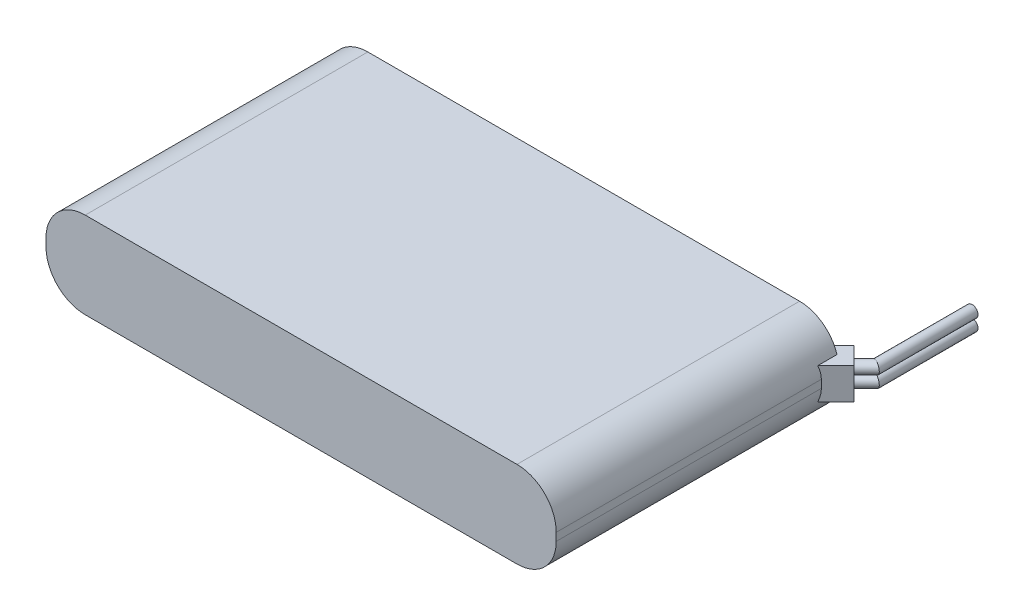
ISO-10303-21;
HEADER;
FILE_DESCRIPTION(('STEP AP214'),'2;1');
FILE_NAME('part.step','',(''),(''),'','','');
FILE_SCHEMA(('AUTOMOTIVE_DESIGN { 1 0 10303 214 1 1 1 1 }'));
ENDSEC;
DATA;
#1=APPLICATION_CONTEXT('core data for automotive mechanical design processes');
#2=APPLICATION_PROTOCOL_DEFINITION('international standard','automotive_design',2000,#1);
#3=PRODUCT_CONTEXT('',#1,'mechanical');
#4=PRODUCT('Part','Part','',(#3));
#5=PRODUCT_RELATED_PRODUCT_CATEGORY('part','',(#4));
#6=PRODUCT_DEFINITION_FORMATION('','',#4);
#7=PRODUCT_DEFINITION_CONTEXT('part definition',#1,'design');
#8=PRODUCT_DEFINITION('design','',#6,#7);
#9=PRODUCT_DEFINITION_SHAPE('','',#8);
#10=(LENGTH_UNIT() NAMED_UNIT(*) SI_UNIT(.MILLI.,.METRE.));
#11=(NAMED_UNIT(*) PLANE_ANGLE_UNIT() SI_UNIT($,.RADIAN.));
#12=(NAMED_UNIT(*) SI_UNIT($,.STERADIAN.) SOLID_ANGLE_UNIT());
#13=UNCERTAINTY_MEASURE_WITH_UNIT(LENGTH_MEASURE(1.E-05),#10,'distance_accuracy_value','');
#14=(GEOMETRIC_REPRESENTATION_CONTEXT(3) GLOBAL_UNCERTAINTY_ASSIGNED_CONTEXT((#13)) GLOBAL_UNIT_ASSIGNED_CONTEXT((#10,
#11,#12)) REPRESENTATION_CONTEXT('',''));
#15=CARTESIAN_POINT('',(0.,0.,0.));
#16=DIRECTION('',(0.,0.,1.));
#17=DIRECTION('',(1.,0.,0.));
#18=AXIS2_PLACEMENT_3D('',#15,#16,#17);
#19=CARTESIAN_POINT('',(-62.2295081967213,22.,-41.1311475409835));
#20=DIRECTION('',(0.,0.,1.));
#21=DIRECTION('',(1.,0.,0.));
#22=AXIS2_PLACEMENT_3D('',#19,#20,#21);
#23=PLANE('',#22);
#24=DIRECTION('',(-1.,0.,0.));
#25=VECTOR('',#24,1.);
#26=CARTESIAN_POINT('',(-62.2295081967213,7.,-41.1311475409835));
#27=LINE('',#26,#25);
#28=CARTESIAN_POINT('',(67.3098838174481,7.,-41.1311475409835));
#29=VERTEX_POINT('',#28);
#30=CARTESIAN_POINT('',(63.3157190818035,7.,-41.1311475409835));
#31=VERTEX_POINT('',#30);
#32=EDGE_CURVE('E207',#29,#31,#27,.T.);
#33=ORIENTED_EDGE('',*,*,#32,.F.);
#34=CARTESIAN_POINT('',(57.7704918032787,10.,-41.1311475409835));
#35=DIRECTION('',(0.,0.,1.));
#36=DIRECTION('',(1.,0.,0.));
#37=AXIS2_PLACEMENT_3D('',#34,#35,#36);
#38=CIRCLE('',#37,10.);
#39=CARTESIAN_POINT('',(57.7704918032787,0.,-41.1311475409835));
#40=VERTEX_POINT('',#39);
#41=EDGE_CURVE('E254',#29,#40,#38,.F.);
#42=ORIENTED_EDGE('',*,*,#41,.T.);
#43=DIRECTION('',(-1.,0.,0.));
#44=VECTOR('',#43,1.);
#45=CARTESIAN_POINT('',(-62.2295081967213,0.,-41.1311475409835));
#46=LINE('',#45,#44);
#47=CARTESIAN_POINT('',(-52.2295081967213,0.,-41.1311475409835));
#48=VERTEX_POINT('',#47);
#49=EDGE_CURVE('E216',#40,#48,#46,.T.);
#50=ORIENTED_EDGE('',*,*,#49,.T.);
#51=CARTESIAN_POINT('',(-52.2295081967213,10.,-41.1311475409835));
#52=DIRECTION('',(0.,0.,1.));
#53=DIRECTION('',(1.,0.,0.));
#54=AXIS2_PLACEMENT_3D('',#51,#52,#53);
#55=CIRCLE('',#54,10.);
#56=CARTESIAN_POINT('',(-62.2295081967213,10.,-41.1311475409835));
#57=VERTEX_POINT('',#56);
#58=EDGE_CURVE('E248',#48,#57,#55,.F.);
#59=ORIENTED_EDGE('',*,*,#58,.T.);
#60=DIRECTION('',(0.,-1.,0.));
#61=VECTOR('',#60,1.);
#62=CARTESIAN_POINT('',(-62.2295081967213,22.,-41.1311475409835));
#63=LINE('',#62,#61);
#64=CARTESIAN_POINT('',(-62.2295081967213,12.,-41.1311475409835));
#65=VERTEX_POINT('',#64);
#66=EDGE_CURVE('E220',#65,#57,#63,.T.);
#67=ORIENTED_EDGE('',*,*,#66,.F.);
#68=CARTESIAN_POINT('',(-52.2295081967213,12.,-41.1311475409835));
#69=DIRECTION('',(0.,0.,1.));
#70=DIRECTION('',(1.,0.,0.));
#71=AXIS2_PLACEMENT_3D('',#68,#69,#70);
#72=CIRCLE('',#71,10.);
#73=CARTESIAN_POINT('',(-52.2295081967213,22.,-41.1311475409835));
#74=VERTEX_POINT('',#73);
#75=EDGE_CURVE('E245',#65,#74,#72,.F.);
#76=ORIENTED_EDGE('',*,*,#75,.T.);
#77=DIRECTION('',(-1.,0.,0.));
#78=VECTOR('',#77,1.);
#79=CARTESIAN_POINT('',(-62.2295081967213,22.,-41.1311475409835));
#80=LINE('',#79,#78);
#81=CARTESIAN_POINT('',(57.7704918032787,22.,-41.1311475409835));
#82=VERTEX_POINT('',#81);
#83=EDGE_CURVE('E215',#82,#74,#80,.T.);
#84=ORIENTED_EDGE('',*,*,#83,.F.);
#85=CARTESIAN_POINT('',(57.7704918032787,12.,-41.1311475409835));
#86=DIRECTION('',(0.,0.,1.));
#87=DIRECTION('',(1.,0.,0.));
#88=AXIS2_PLACEMENT_3D('',#85,#86,#87);
#89=CIRCLE('',#88,10.);
#90=CARTESIAN_POINT('',(67.3098838174481,15.,-41.1311475409835));
#91=VERTEX_POINT('',#90);
#92=EDGE_CURVE('E251',#82,#91,#89,.F.);
#93=ORIENTED_EDGE('',*,*,#92,.T.);
#94=DIRECTION('',(-1.,0.,0.));
#95=VECTOR('',#94,1.);
#96=CARTESIAN_POINT('',(-62.2295081967213,15.,-41.1311475409835));
#97=LINE('',#96,#95);
#98=CARTESIAN_POINT('',(63.3157190818035,15.,-41.1311475409835));
#99=VERTEX_POINT('',#98);
#100=EDGE_CURVE('E89',#91,#99,#97,.T.);
#101=ORIENTED_EDGE('',*,*,#100,.T.);
#102=DIRECTION('',(0.,1.,0.));
#103=VECTOR('',#102,1.);
#104=CARTESIAN_POINT('',(63.3157190818035,22.,-41.1311475409835));
#105=LINE('',#104,#103);
#106=EDGE_CURVE('E78',#31,#99,#105,.T.);
#107=ORIENTED_EDGE('',*,*,#106,.F.);
#108=EDGE_LOOP('',(#33,#42,#50,#59,#67,#76,#84,#93,#101,#107));
#109=FACE_BOUND('',#108,.T.);
#110=ADVANCED_FACE('F69',(#109),#23,.F.);
#111=CARTESIAN_POINT('',(-62.2295081967213,22.,-41.1311475409835));
#112=DIRECTION('',(1.,0.,0.));
#113=DIRECTION('',(0.,0.,-1.));
#114=AXIS2_PLACEMENT_3D('',#111,#112,#113);
#115=PLANE('',#114);
#116=ORIENTED_EDGE('',*,*,#66,.T.);
#117=DIRECTION('',(0.,0.,1.));
#118=VECTOR('',#117,1.);
#119=CARTESIAN_POINT('',(-62.2295081967213,10.,-41.1311475409835));
#120=LINE('',#119,#118);
#121=CARTESIAN_POINT('',(-62.2295081967213,10.,30.8688524590165));
#122=VERTEX_POINT('',#121);
#123=EDGE_CURVE('E286',#57,#122,#120,.T.);
#124=ORIENTED_EDGE('',*,*,#123,.T.);
#125=DIRECTION('',(0.,-1.,0.));
#126=VECTOR('',#125,1.);
#127=CARTESIAN_POINT('',(-62.2295081967213,22.,30.8688524590165));
#128=LINE('',#127,#126);
#129=CARTESIAN_POINT('',(-62.2295081967213,12.,30.8688524590165));
#130=VERTEX_POINT('',#129);
#131=EDGE_CURVE('E234',#130,#122,#128,.T.);
#132=ORIENTED_EDGE('',*,*,#131,.F.);
#133=DIRECTION('',(0.,0.,1.));
#134=VECTOR('',#133,1.);
#135=CARTESIAN_POINT('',(-62.2295081967213,12.,-41.1311475409835));
#136=LINE('',#135,#134);
#137=EDGE_CURVE('E283',#130,#65,#136,.F.);
#138=ORIENTED_EDGE('',*,*,#137,.T.);
#139=EDGE_LOOP('',(#116,#124,#132,#138));
#140=FACE_BOUND('',#139,.T.);
#141=ADVANCED_FACE('F352',(#140),#115,.F.);
#142=CARTESIAN_POINT('',(-62.2295081967213,22.,30.8688524590165));
#143=DIRECTION('',(0.,0.,-1.));
#144=DIRECTION('',(-1.,0.,0.));
#145=AXIS2_PLACEMENT_3D('',#142,#143,#144);
#146=PLANE('',#145);
#147=DIRECTION('',(1.,0.,0.));
#148=VECTOR('',#147,1.);
#149=CARTESIAN_POINT('',(-62.2295081967213,0.,30.8688524590165));
#150=LINE('',#149,#148);
#151=CARTESIAN_POINT('',(-52.2295081967213,0.,30.8688524590165));
#152=VERTEX_POINT('',#151);
#153=CARTESIAN_POINT('',(57.7704918032787,0.,30.8688524590165));
#154=VERTEX_POINT('',#153);
#155=EDGE_CURVE('E210',#152,#154,#150,.T.);
#156=ORIENTED_EDGE('',*,*,#155,.T.);
#157=CARTESIAN_POINT('',(57.7704918032787,10.,30.8688524590165));
#158=DIRECTION('',(0.,0.,-1.));
#159=DIRECTION('',(-1.,0.,0.));
#160=AXIS2_PLACEMENT_3D('',#157,#158,#159);
#161=CIRCLE('',#160,10.);
#162=CARTESIAN_POINT('',(67.7704918032787,10.,30.8688524590165));
#163=VERTEX_POINT('',#162);
#164=EDGE_CURVE('E272',#154,#163,#161,.F.);
#165=ORIENTED_EDGE('',*,*,#164,.T.);
#166=DIRECTION('',(0.,-1.,0.));
#167=VECTOR('',#166,1.);
#168=CARTESIAN_POINT('',(67.7704918032787,22.,30.8688524590165));
#169=LINE('',#168,#167);
#170=CARTESIAN_POINT('',(67.7704918032787,12.,30.8688524590165));
#171=VERTEX_POINT('',#170);
#172=EDGE_CURVE('E230',#171,#163,#169,.T.);
#173=ORIENTED_EDGE('',*,*,#172,.F.);
#174=CARTESIAN_POINT('',(57.7704918032787,12.,30.8688524590165));
#175=DIRECTION('',(0.,0.,-1.));
#176=DIRECTION('',(-1.,0.,0.));
#177=AXIS2_PLACEMENT_3D('',#174,#175,#176);
#178=CIRCLE('',#177,10.);
#179=CARTESIAN_POINT('',(57.7704918032787,22.,30.8688524590165));
#180=VERTEX_POINT('',#179);
#181=EDGE_CURVE('E269',#171,#180,#178,.F.);
#182=ORIENTED_EDGE('',*,*,#181,.T.);
#183=DIRECTION('',(1.,0.,0.));
#184=VECTOR('',#183,1.);
#185=CARTESIAN_POINT('',(-62.2295081967213,22.,30.8688524590165));
#186=LINE('',#185,#184);
#187=CARTESIAN_POINT('',(-52.2295081967213,22.,30.8688524590165));
#188=VERTEX_POINT('',#187);
#189=EDGE_CURVE('E211',#188,#180,#186,.T.);
#190=ORIENTED_EDGE('',*,*,#189,.F.);
#191=CARTESIAN_POINT('',(-52.2295081967213,12.,30.8688524590165));
#192=DIRECTION('',(0.,0.,-1.));
#193=DIRECTION('',(-1.,0.,0.));
#194=AXIS2_PLACEMENT_3D('',#191,#192,#193);
#195=CIRCLE('',#194,10.);
#196=EDGE_CURVE('E263',#188,#130,#195,.F.);
#197=ORIENTED_EDGE('',*,*,#196,.T.);
#198=ORIENTED_EDGE('',*,*,#131,.T.);
#199=CARTESIAN_POINT('',(-52.2295081967213,10.,30.8688524590165));
#200=DIRECTION('',(0.,0.,-1.));
#201=DIRECTION('',(-1.,0.,0.));
#202=AXIS2_PLACEMENT_3D('',#199,#200,#201);
#203=CIRCLE('',#202,10.);
#204=EDGE_CURVE('E266',#122,#152,#203,.F.);
#205=ORIENTED_EDGE('',*,*,#204,.T.);
#206=EDGE_LOOP('',(#156,#165,#173,#182,#190,#197,#198,#205));
#207=FACE_BOUND('',#206,.T.);
#208=ADVANCED_FACE('F359',(#207),#146,.F.);
#209=CARTESIAN_POINT('',(67.7704918032787,22.,-41.1311475409835));
#210=DIRECTION('',(-1.,0.,0.));
#211=DIRECTION('',(0.,0.,1.));
#212=AXIS2_PLACEMENT_3D('',#209,#210,#211);
#213=PLANE('',#212);
#214=DIRECTION('',(0.,0.,-1.));
#215=VECTOR('',#214,1.);
#216=CARTESIAN_POINT('',(67.7704918032787,10.,-41.1311475409835));
#217=LINE('',#216,#215);
#218=CARTESIAN_POINT('',(67.7704918032787,10.,-36.6763748195082));
#219=VERTEX_POINT('',#218);
#220=EDGE_CURVE('E241',#163,#219,#217,.T.);
#221=ORIENTED_EDGE('',*,*,#220,.T.);
#222=DIRECTION('',(0.,1.,0.));
#223=VECTOR('',#222,1.);
#224=CARTESIAN_POINT('',(67.7704918032787,22.,-36.6763748195082));
#225=LINE('',#224,#223);
#226=CARTESIAN_POINT('',(67.7704918032787,12.,-36.6763748195082));
#227=VERTEX_POINT('',#226);
#228=EDGE_CURVE('E202',#219,#227,#225,.T.);
#229=ORIENTED_EDGE('',*,*,#228,.T.);
#230=DIRECTION('',(0.,0.,-1.));
#231=VECTOR('',#230,1.);
#232=CARTESIAN_POINT('',(67.7704918032787,12.,30.8688524590165));
#233=LINE('',#232,#231);
#234=EDGE_CURVE('E238',#227,#171,#233,.F.);
#235=ORIENTED_EDGE('',*,*,#234,.T.);
#236=ORIENTED_EDGE('',*,*,#172,.T.);
#237=EDGE_LOOP('',(#221,#229,#235,#236));
#238=FACE_BOUND('',#237,.T.);
#239=ADVANCED_FACE('F366',(#238),#213,.F.);
#240=CARTESIAN_POINT('',(0.,22.,0.));
#241=DIRECTION('',(0.,1.,0.));
#242=DIRECTION('',(0.,0.,1.));
#243=AXIS2_PLACEMENT_3D('',#240,#241,#242);
#244=PLANE('',#243);
#245=ORIENTED_EDGE('',*,*,#189,.T.);
#246=DIRECTION('',(0.,0.,-1.));
#247=VECTOR('',#246,1.);
#248=CARTESIAN_POINT('',(57.7704918032787,22.,-41.1311475409835));
#249=LINE('',#248,#247);
#250=EDGE_CURVE('E279',#180,#82,#249,.T.);
#251=ORIENTED_EDGE('',*,*,#250,.T.);
#252=ORIENTED_EDGE('',*,*,#83,.T.);
#253=DIRECTION('',(0.,0.,1.));
#254=VECTOR('',#253,1.);
#255=CARTESIAN_POINT('',(-52.2295081967213,22.,30.8688524590165));
#256=LINE('',#255,#254);
#257=EDGE_CURVE('E275',#74,#188,#256,.T.);
#258=ORIENTED_EDGE('',*,*,#257,.T.);
#259=EDGE_LOOP('',(#245,#251,#252,#258));
#260=FACE_BOUND('',#259,.T.);
#261=ADVANCED_FACE('F368',(#260),#244,.T.);
#262=CARTESIAN_POINT('',(0.,0.,0.));
#263=DIRECTION('',(0.,1.,0.));
#264=DIRECTION('',(0.,0.,1.));
#265=AXIS2_PLACEMENT_3D('',#262,#263,#264);
#266=PLANE('',#265);
#267=ORIENTED_EDGE('',*,*,#49,.F.);
#268=DIRECTION('',(0.,0.,-1.));
#269=VECTOR('',#268,1.);
#270=CARTESIAN_POINT('',(57.7704918032787,0.,0.));
#271=LINE('',#270,#269);
#272=EDGE_CURVE('E260',#40,#154,#271,.F.);
#273=ORIENTED_EDGE('',*,*,#272,.T.);
#274=ORIENTED_EDGE('',*,*,#155,.F.);
#275=DIRECTION('',(0.,0.,1.));
#276=VECTOR('',#275,1.);
#277=CARTESIAN_POINT('',(-52.2295081967213,0.,0.));
#278=LINE('',#277,#276);
#279=EDGE_CURVE('E257',#152,#48,#278,.F.);
#280=ORIENTED_EDGE('',*,*,#279,.T.);
#281=EDGE_LOOP('',(#267,#273,#274,#280));
#282=FACE_BOUND('',#281,.T.);
#283=ADVANCED_FACE('F364',(#282),#266,.F.);
#284=CARTESIAN_POINT('',(57.7704918032787,10.,-41.1311475409835));
#285=DIRECTION('',(0.,0.,-1.));
#286=DIRECTION('',(-1.,0.,0.));
#287=AXIS2_PLACEMENT_3D('',#284,#285,#286);
#288=CYLINDRICAL_SURFACE('',#287,10.);
#289=CARTESIAN_POINT('',(57.7704918032787,10.,-26.6763748195083));
#290=DIRECTION('',(0.707106781186546,0.,0.707106781186549));
#291=DIRECTION('',(0.707106781186549,0.,-0.707106781186546));
#292=AXIS2_PLACEMENT_3D('',#289,#290,#291);
#293=ELLIPSE('',#292,14.1421356237309,10.);
#294=CARTESIAN_POINT('',(67.3098838174481,7.,-36.2157668336777));
#295=VERTEX_POINT('',#294);
#296=EDGE_CURVE('E172',#219,#295,#293,.F.);
#297=ORIENTED_EDGE('',*,*,#296,.F.);
#298=ORIENTED_EDGE('',*,*,#220,.F.);
#299=ORIENTED_EDGE('',*,*,#164,.F.);
#300=ORIENTED_EDGE('',*,*,#272,.F.);
#301=ORIENTED_EDGE('',*,*,#41,.F.);
#302=DIRECTION('',(0.,0.,-1.));
#303=VECTOR('',#302,1.);
#304=CARTESIAN_POINT('',(67.3098838174481,7.,-41.1311475409835));
#305=LINE('',#304,#303);
#306=EDGE_CURVE('E298',#29,#295,#305,.F.);
#307=ORIENTED_EDGE('',*,*,#306,.T.);
#308=EDGE_LOOP('',(#297,#298,#299,#300,#301,#307));
#309=FACE_BOUND('',#308,.T.);
#310=ADVANCED_FACE('F373',(#309),#288,.T.);
#311=CARTESIAN_POINT('',(57.7704918032787,12.,0.));
#312=DIRECTION('',(0.,0.,1.));
#313=DIRECTION('',(1.,0.,0.));
#314=AXIS2_PLACEMENT_3D('',#311,#312,#313);
#315=CYLINDRICAL_SURFACE('',#314,10.);
#316=CARTESIAN_POINT('',(57.7704918032787,12.,-26.6763748195083));
#317=DIRECTION('',(0.707106781186546,0.,0.707106781186549));
#318=DIRECTION('',(-0.707106781186549,0.,0.707106781186546));
#319=AXIS2_PLACEMENT_3D('',#316,#317,#318);
#320=ELLIPSE('',#319,14.1421356237309,10.);
#321=CARTESIAN_POINT('',(67.3098838174481,15.,-36.2157668336777));
#322=VERTEX_POINT('',#321);
#323=EDGE_CURVE('E294',#322,#227,#320,.F.);
#324=ORIENTED_EDGE('',*,*,#323,.F.);
#325=DIRECTION('',(0.,0.,1.));
#326=VECTOR('',#325,1.);
#327=CARTESIAN_POINT('',(67.3098838174482,15.,0.));
#328=LINE('',#327,#326);
#329=EDGE_CURVE('E290',#91,#322,#328,.T.);
#330=ORIENTED_EDGE('',*,*,#329,.F.);
#331=ORIENTED_EDGE('',*,*,#92,.F.);
#332=ORIENTED_EDGE('',*,*,#250,.F.);
#333=ORIENTED_EDGE('',*,*,#181,.F.);
#334=ORIENTED_EDGE('',*,*,#234,.F.);
#335=EDGE_LOOP('',(#324,#330,#331,#332,#333,#334));
#336=FACE_BOUND('',#335,.T.);
#337=ADVANCED_FACE('F376',(#336),#315,.T.);
#338=CARTESIAN_POINT('',(-52.2295081967213,10.,-41.1311475409835));
#339=DIRECTION('',(0.,0.,1.));
#340=DIRECTION('',(1.,0.,0.));
#341=AXIS2_PLACEMENT_3D('',#338,#339,#340);
#342=CYLINDRICAL_SURFACE('',#341,10.);
#343=ORIENTED_EDGE('',*,*,#58,.F.);
#344=ORIENTED_EDGE('',*,*,#279,.F.);
#345=ORIENTED_EDGE('',*,*,#204,.F.);
#346=ORIENTED_EDGE('',*,*,#123,.F.);
#347=EDGE_LOOP('',(#343,#344,#345,#346));
#348=FACE_BOUND('',#347,.T.);
#349=ADVANCED_FACE('F379',(#348),#342,.T.);
#350=CARTESIAN_POINT('',(-52.2295081967213,12.,0.));
#351=DIRECTION('',(0.,0.,-1.));
#352=DIRECTION('',(-1.,0.,0.));
#353=AXIS2_PLACEMENT_3D('',#350,#351,#352);
#354=CYLINDRICAL_SURFACE('',#353,10.);
#355=ORIENTED_EDGE('',*,*,#75,.F.);
#356=ORIENTED_EDGE('',*,*,#137,.F.);
#357=ORIENTED_EDGE('',*,*,#196,.F.);
#358=ORIENTED_EDGE('',*,*,#257,.F.);
#359=EDGE_LOOP('',(#355,#356,#357,#358));
#360=FACE_BOUND('',#359,.T.);
#361=ADVANCED_FACE('F71',(#360),#354,.T.);
#362=CARTESIAN_POINT('',(62.5333888889699,7.,-40.3488173481499));
#363=DIRECTION('',(0.707106781186544,0.,0.707106781186551));
#364=DIRECTION('',(0.707106781186551,0.,-0.707106781186544));
#365=AXIS2_PLACEMENT_3D('',#362,#363,#364);
#366=PLANE('',#365);
#367=DIRECTION('',(0.707106781186551,0.,-0.707106781186544));
#368=VECTOR('',#367,1.);
#369=CARTESIAN_POINT('',(62.5333888889699,7.,-40.3488173481499));
#370=LINE('',#369,#368);
#371=CARTESIAN_POINT('',(67.4831363572757,7.,-45.2985648164557));
#372=VERTEX_POINT('',#371);
#373=EDGE_CURVE('E182',#31,#372,#370,.T.);
#374=ORIENTED_EDGE('',*,*,#373,.F.);
#375=ORIENTED_EDGE('',*,*,#106,.T.);
#376=DIRECTION('',(0.707106781186551,0.,-0.707106781186544));
#377=VECTOR('',#376,1.);
#378=CARTESIAN_POINT('',(62.5333888889699,15.,-40.3488173481499));
#379=LINE('',#378,#377);
#380=CARTESIAN_POINT('',(67.4831363572757,15.,-45.2985648164557));
#381=VERTEX_POINT('',#380);
#382=EDGE_CURVE('E177',#99,#381,#379,.T.);
#383=ORIENTED_EDGE('',*,*,#382,.T.);
#384=DIRECTION('',(0.,1.,0.));
#385=VECTOR('',#384,1.);
#386=CARTESIAN_POINT('',(67.4831363572757,7.,-45.2985648164557));
#387=LINE('',#386,#385);
#388=EDGE_CURVE('E192',#372,#381,#387,.T.);
#389=ORIENTED_EDGE('',*,*,#388,.F.);
#390=EDGE_LOOP('',(#374,#375,#383,#389));
#391=FACE_BOUND('',#390,.T.);
#392=ADVANCED_FACE('F303',(#391),#366,.F.);
#393=CARTESIAN_POINT('',(0.,7.,0.));
#394=DIRECTION('',(0.,1.,0.));
#395=DIRECTION('',(0.,0.,1.));
#396=AXIS2_PLACEMENT_3D('',#393,#394,#395);
#397=PLANE('',#396);
#398=ORIENTED_EDGE('',*,*,#306,.F.);
#399=ORIENTED_EDGE('',*,*,#32,.T.);
#400=ORIENTED_EDGE('',*,*,#373,.T.);
#401=DIRECTION('',(0.707106781186546,0.,0.707106781186549));
#402=VECTOR('',#401,1.);
#403=CARTESIAN_POINT('',(67.4831363572757,7.,-45.2985648164557));
#404=LINE('',#403,#402);
#405=CARTESIAN_POINT('',(71.937909078751,7.,-40.8437920949805));
#406=VERTEX_POINT('',#405);
#407=EDGE_CURVE('E176',#372,#406,#404,.T.);
#408=ORIENTED_EDGE('',*,*,#407,.T.);
#409=DIRECTION('',(0.707106781186549,0.,-0.707106781186546));
#410=VECTOR('',#409,1.);
#411=CARTESIAN_POINT('',(66.9881616104451,7.,-35.8940446266746));
#412=LINE('',#411,#410);
#413=EDGE_CURVE('E164',#295,#406,#412,.T.);
#414=ORIENTED_EDGE('',*,*,#413,.F.);
#415=EDGE_LOOP('',(#398,#399,#400,#408,#414));
#416=FACE_BOUND('',#415,.T.);
#417=ADVANCED_FACE('F180',(#416),#397,.F.);
#418=CARTESIAN_POINT('',(0.,15.,0.));
#419=DIRECTION('',(0.,1.,0.));
#420=DIRECTION('',(0.,0.,1.));
#421=AXIS2_PLACEMENT_3D('',#418,#419,#420);
#422=PLANE('',#421);
#423=ORIENTED_EDGE('',*,*,#100,.F.);
#424=ORIENTED_EDGE('',*,*,#329,.T.);
#425=DIRECTION('',(0.707106781186549,0.,-0.707106781186546));
#426=VECTOR('',#425,1.);
#427=CARTESIAN_POINT('',(66.9881616104451,15.,-35.8940446266746));
#428=LINE('',#427,#426);
#429=CARTESIAN_POINT('',(71.937909078751,15.,-40.8437920949805));
#430=VERTEX_POINT('',#429);
#431=EDGE_CURVE('E308',#322,#430,#428,.T.);
#432=ORIENTED_EDGE('',*,*,#431,.T.);
#433=DIRECTION('',(0.707106781186546,0.,0.707106781186549));
#434=VECTOR('',#433,1.);
#435=CARTESIAN_POINT('',(67.4831363572757,15.,-45.2985648164557));
#436=LINE('',#435,#434);
#437=EDGE_CURVE('E190',#381,#430,#436,.T.);
#438=ORIENTED_EDGE('',*,*,#437,.F.);
#439=ORIENTED_EDGE('',*,*,#382,.F.);
#440=EDGE_LOOP('',(#423,#424,#432,#438,#439));
#441=FACE_BOUND('',#440,.T.);
#442=ADVANCED_FACE('F305',(#441),#422,.T.);
#443=CARTESIAN_POINT('',(67.4831363572757,7.,-45.2985648164557));
#444=DIRECTION('',(-0.707106781186549,0.,0.707106781186546));
#445=DIRECTION('',(0.707106781186546,0.,0.707106781186549));
#446=AXIS2_PLACEMENT_3D('',#443,#444,#445);
#447=PLANE('',#446);
#448=CARTESIAN_POINT('',(69.6890660915396,9.5,-43.0926350821918));
#449=DIRECTION('',(-0.707106781186549,0.,0.707106781186546));
#450=DIRECTION('',(0.707106781186546,0.,0.707106781186549));
#451=AXIS2_PLACEMENT_3D('',#448,#449,#450);
#452=CIRCLE('',#451,1.475);
#453=CARTESIAN_POINT('',(70.7320485937898,9.5,-42.0496525799417));
#454=VERTEX_POINT('',#453);
#455=EDGE_CURVE('E12',#454,#454,#452,.F.);
#456=ORIENTED_EDGE('',*,*,#455,.F.);
#457=EDGE_LOOP('',(#456));
#458=FACE_BOUND('',#457,.T.);
#459=CARTESIAN_POINT('',(69.6890660915396,12.5,-43.0926350821918));
#460=DIRECTION('',(-0.707106781186548,0.,0.707106781186548));
#461=DIRECTION('',(0.707106781186548,0.,0.707106781186548));
#462=AXIS2_PLACEMENT_3D('',#459,#460,#461);
#463=CIRCLE('',#462,1.475);
#464=CARTESIAN_POINT('',(70.7320485937898,12.5,-42.0496525799417));
#465=VERTEX_POINT('',#464);
#466=EDGE_CURVE('E318',#465,#465,#463,.T.);
#467=ORIENTED_EDGE('',*,*,#466,.T.);
#468=EDGE_LOOP('',(#467));
#469=FACE_BOUND('',#468,.T.);
#470=ORIENTED_EDGE('',*,*,#437,.T.);
#471=DIRECTION('',(0.,1.,0.));
#472=VECTOR('',#471,1.);
#473=CARTESIAN_POINT('',(71.937909078751,7.,-40.8437920949805));
#474=LINE('',#473,#472);
#475=EDGE_CURVE('E170',#406,#430,#474,.T.);
#476=ORIENTED_EDGE('',*,*,#475,.F.);
#477=ORIENTED_EDGE('',*,*,#407,.F.);
#478=ORIENTED_EDGE('',*,*,#388,.T.);
#479=EDGE_LOOP('',(#470,#476,#477,#478));
#480=FACE_BOUND('',#479,.T.);
#481=ADVANCED_FACE('F188',(#458,#469,#480),#447,.F.);
#482=CARTESIAN_POINT('',(66.9881616104451,7.,-35.8940446266746));
#483=DIRECTION('',(0.707106781186546,0.,0.707106781186549));
#484=DIRECTION('',(0.707106781186549,0.,-0.707106781186546));
#485=AXIS2_PLACEMENT_3D('',#482,#483,#484);
#486=PLANE('',#485);
#487=ORIENTED_EDGE('',*,*,#228,.F.);
#488=ORIENTED_EDGE('',*,*,#296,.T.);
#489=ORIENTED_EDGE('',*,*,#413,.T.);
#490=ORIENTED_EDGE('',*,*,#475,.T.);
#491=ORIENTED_EDGE('',*,*,#431,.F.);
#492=ORIENTED_EDGE('',*,*,#323,.T.);
#493=EDGE_LOOP('',(#487,#488,#489,#490,#491,#492));
#494=FACE_BOUND('',#493,.T.);
#495=ADVANCED_FACE('F167',(#494),#486,.T.);
#496=CARTESIAN_POINT('',(72.4704483182817,12.5,-70.4174675859399));
#497=DIRECTION('',(0.,0.,1.));
#498=DIRECTION('',(1.,0.,0.));
#499=AXIS2_PLACEMENT_3D('',#496,#497,#498);
#500=PLANE('',#499);
#501=CARTESIAN_POINT('',(72.4704483182817,12.5,-70.4174675859399));
#502=DIRECTION('',(0.,0.,1.));
#503=DIRECTION('',(1.,0.,0.));
#504=AXIS2_PLACEMENT_3D('',#501,#502,#503);
#505=CIRCLE('',#504,1.475);
#506=CARTESIAN_POINT('',(73.9454483182817,12.5,-70.4174675859399));
#507=VERTEX_POINT('',#506);
#508=EDGE_CURVE('E314',#507,#507,#505,.T.);
#509=ORIENTED_EDGE('',*,*,#508,.F.);
#510=EDGE_LOOP('',(#509));
#511=FACE_BOUND('',#510,.T.);
#512=ADVANCED_FACE('F341',(#511),#500,.F.);
#513=CARTESIAN_POINT('',(72.4704483182817,12.5,-45.1019558039835));
#514=DIRECTION('',(0.,0.,-1.));
#515=DIRECTION('',(-1.,0.,0.));
#516=AXIS2_PLACEMENT_3D('',#513,#514,#515);
#517=CYLINDRICAL_SURFACE('',#516,1.475);
#518=CARTESIAN_POINT('',(72.4704483182817,12.5,-45.8740173089339));
#519=DIRECTION('',(0.38268343236509,0.,-0.923879532511287));
#520=DIRECTION('',(0.923879532511287,0.,0.38268343236509));
#521=AXIS2_PLACEMENT_3D('',#518,#519,#520);
#522=ELLIPSE('',#521,1.59652849543129,1.475);
#523=CARTESIAN_POINT('',(73.9454483182817,12.5,-45.2630523044336));
#524=VERTEX_POINT('',#523);
#525=EDGE_CURVE('E312',#524,#524,#522,.T.);
#526=ORIENTED_EDGE('',*,*,#525,.T.);
#527=EDGE_LOOP('',(#526));
#528=FACE_BOUND('',#527,.T.);
#529=ORIENTED_EDGE('',*,*,#508,.T.);
#530=EDGE_LOOP('',(#529));
#531=FACE_BOUND('',#530,.T.);
#532=ADVANCED_FACE('F348',(#528,#531),#517,.T.);
#533=CARTESIAN_POINT('',(69.6890660915396,12.5,-43.0926350821918));
#534=DIRECTION('',(0.707106781186547,0.,-0.707106781186547));
#535=DIRECTION('',(-0.707106781186548,0.,-0.707106781186548));
#536=AXIS2_PLACEMENT_3D('',#533,#534,#535);
#537=CYLINDRICAL_SURFACE('',#536,1.475);
#538=ORIENTED_EDGE('',*,*,#466,.F.);
#539=EDGE_LOOP('',(#538));
#540=FACE_BOUND('',#539,.T.);
#541=ORIENTED_EDGE('',*,*,#525,.F.);
#542=EDGE_LOOP('',(#541));
#543=FACE_BOUND('',#542,.T.);
#544=ADVANCED_FACE('F417',(#540,#543),#537,.T.);
#545=CARTESIAN_POINT('',(72.4704483182817,9.5,-70.4174675859399));
#546=DIRECTION('',(0.,0.,1.));
#547=DIRECTION('',(1.,0.,0.));
#548=AXIS2_PLACEMENT_3D('',#545,#546,#547);
#549=PLANE('',#548);
#550=CARTESIAN_POINT('',(72.4704483182817,9.5,-70.4174675859399));
#551=DIRECTION('',(0.,0.,-1.));
#552=DIRECTION('',(1.,0.,0.));
#553=AXIS2_PLACEMENT_3D('',#550,#551,#552);
#554=CIRCLE('',#553,1.475);
#555=CARTESIAN_POINT('',(73.9454483182817,9.5,-70.4174675859399));
#556=VERTEX_POINT('',#555);
#557=EDGE_CURVE('E326',#556,#556,#554,.F.);
#558=ORIENTED_EDGE('',*,*,#557,.F.);
#559=EDGE_LOOP('',(#558));
#560=FACE_BOUND('',#559,.T.);
#561=ADVANCED_FACE('F345',(#560),#549,.F.);
#562=CARTESIAN_POINT('',(72.4704483182817,9.5,-45.1019558039835));
#563=DIRECTION('',(0.,0.,-1.));
#564=DIRECTION('',(-1.,0.,0.));
#565=AXIS2_PLACEMENT_3D('',#562,#563,#564);
#566=CYLINDRICAL_SURFACE('',#565,1.475);
#567=CARTESIAN_POINT('',(72.4704483182817,9.5,-45.8740173089339));
#568=DIRECTION('',(0.38268343236509,0.,-0.923879532511287));
#569=DIRECTION('',(0.923879532511287,0.,0.38268343236509));
#570=AXIS2_PLACEMENT_3D('',#567,#568,#569);
#571=ELLIPSE('',#570,1.59652849543129,1.475);
#572=CARTESIAN_POINT('',(73.9454483182817,9.5,-45.2630523044336));
#573=VERTEX_POINT('',#572);
#574=EDGE_CURVE('E319',#573,#573,#571,.T.);
#575=ORIENTED_EDGE('',*,*,#574,.T.);
#576=EDGE_LOOP('',(#575));
#577=FACE_BOUND('',#576,.T.);
#578=ORIENTED_EDGE('',*,*,#557,.T.);
#579=EDGE_LOOP('',(#578));
#580=FACE_BOUND('',#579,.T.);
#581=ADVANCED_FACE('F334',(#577,#580),#566,.T.);
#582=CARTESIAN_POINT('',(69.6890660915396,9.5,-43.0926350821918));
#583=DIRECTION('',(0.707106781186547,0.,-0.707106781186547));
#584=DIRECTION('',(-0.707106781186548,0.,-0.707106781186548));
#585=AXIS2_PLACEMENT_3D('',#582,#583,#584);
#586=CYLINDRICAL_SURFACE('',#585,1.475);
#587=ORIENTED_EDGE('',*,*,#455,.T.);
#588=EDGE_LOOP('',(#587));
#589=FACE_BOUND('',#588,.T.);
#590=ORIENTED_EDGE('',*,*,#574,.F.);
#591=EDGE_LOOP('',(#590));
#592=FACE_BOUND('',#591,.T.);
#593=ADVANCED_FACE('F337',(#589,#592),#586,.T.);
#594=CLOSED_SHELL('',(#110,#141,#208,#239,#261,#283,#310,#337,#349,#361,#392,#417,#442,#481,
#495,#512,#532,#544,#561,#581,#593));
#595=MANIFOLD_SOLID_BREP('B2',#594);
#596=ADVANCED_BREP_SHAPE_REPRESENTATION('',(#18,#595),#14);
#597=SHAPE_DEFINITION_REPRESENTATION(#9,#596);
ENDSEC;
END-ISO-10303-21;
